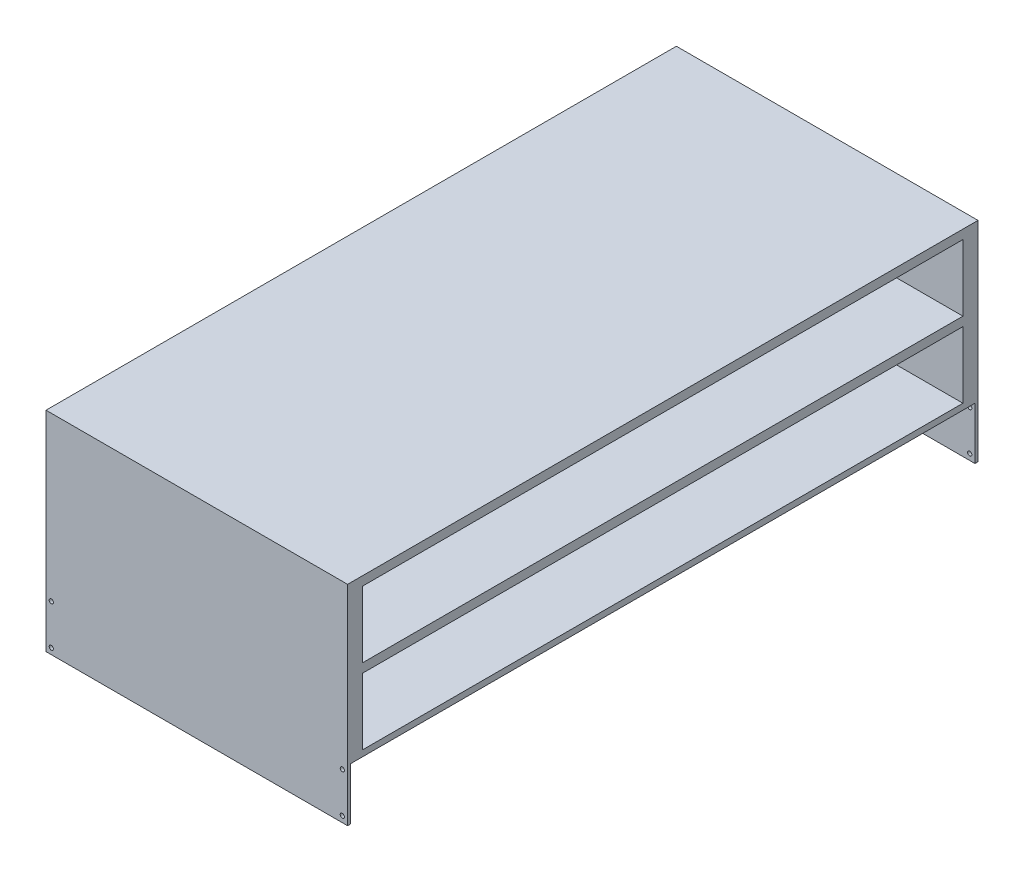
ISO-10303-21;
HEADER;
FILE_DESCRIPTION(('STEP AP214'),'2;1');
FILE_NAME('part.step','',(''),(''),'','','');
FILE_SCHEMA(('AUTOMOTIVE_DESIGN { 1 0 10303 214 1 1 1 1 }'));
ENDSEC;
DATA;
#1=APPLICATION_CONTEXT('core data for automotive mechanical design processes');
#2=APPLICATION_PROTOCOL_DEFINITION('international standard','automotive_design',2000,#1);
#3=PRODUCT_CONTEXT('',#1,'mechanical');
#4=PRODUCT('Part','Part','',(#3));
#5=PRODUCT_RELATED_PRODUCT_CATEGORY('part','',(#4));
#6=PRODUCT_DEFINITION_FORMATION('','',#4);
#7=PRODUCT_DEFINITION_CONTEXT('part definition',#1,'design');
#8=PRODUCT_DEFINITION('design','',#6,#7);
#9=PRODUCT_DEFINITION_SHAPE('','',#8);
#10=(LENGTH_UNIT() NAMED_UNIT(*) SI_UNIT(.MILLI.,.METRE.));
#11=(NAMED_UNIT(*) PLANE_ANGLE_UNIT() SI_UNIT($,.RADIAN.));
#12=(NAMED_UNIT(*) SI_UNIT($,.STERADIAN.) SOLID_ANGLE_UNIT());
#13=UNCERTAINTY_MEASURE_WITH_UNIT(LENGTH_MEASURE(1.E-05),#10,'distance_accuracy_value','');
#14=(GEOMETRIC_REPRESENTATION_CONTEXT(3) GLOBAL_UNCERTAINTY_ASSIGNED_CONTEXT((#13)) GLOBAL_UNIT_ASSIGNED_CONTEXT((#10,
#11,#12)) REPRESENTATION_CONTEXT('',''));
#15=CARTESIAN_POINT('',(0.,0.,0.));
#16=DIRECTION('',(0.,0.,1.));
#17=DIRECTION('',(1.,0.,0.));
#18=AXIS2_PLACEMENT_3D('',#15,#16,#17);
#19=CARTESIAN_POINT('',(500.,606.605,2040.));
#20=DIRECTION('',(0.,0.,1.));
#21=DIRECTION('',(1.,0.,0.));
#22=AXIS2_PLACEMENT_3D('',#19,#20,#21);
#23=PLANE('',#22);
#24=DIRECTION('',(-1.,0.,0.));
#25=VECTOR('',#24,1.);
#26=CARTESIAN_POINT('',(500.,576.605,2040.));
#27=LINE('',#26,#25);
#28=CARTESIAN_POINT('',(500.,576.605,2040.));
#29=VERTEX_POINT('',#28);
#30=CARTESIAN_POINT('',(-500.,576.605,2040.));
#31=VERTEX_POINT('',#30);
#32=EDGE_CURVE('E157',#29,#31,#27,.T.);
#33=ORIENTED_EDGE('',*,*,#32,.F.);
#34=DIRECTION('',(0.,-1.,0.));
#35=VECTOR('',#34,1.);
#36=CARTESIAN_POINT('',(500.,606.605,2040.));
#37=LINE('',#36,#35);
#38=CARTESIAN_POINT('',(500.,356.605,2040.));
#39=VERTEX_POINT('',#38);
#40=EDGE_CURVE('E165',#29,#39,#37,.T.);
#41=ORIENTED_EDGE('',*,*,#40,.T.);
#42=DIRECTION('',(1.,0.,0.));
#43=VECTOR('',#42,1.);
#44=CARTESIAN_POINT('',(-500.,356.605,2040.));
#45=LINE('',#44,#43);
#46=CARTESIAN_POINT('',(-500.,356.605,2040.));
#47=VERTEX_POINT('',#46);
#48=EDGE_CURVE('E322',#47,#39,#45,.T.);
#49=ORIENTED_EDGE('',*,*,#48,.F.);
#50=DIRECTION('',(0.,-1.,0.));
#51=VECTOR('',#50,1.);
#52=CARTESIAN_POINT('',(-500.,606.605,2040.));
#53=LINE('',#52,#51);
#54=EDGE_CURVE('E191',#31,#47,#53,.T.);
#55=ORIENTED_EDGE('',*,*,#54,.F.);
#56=EDGE_LOOP('',(#33,#41,#49,#55));
#57=FACE_BOUND('',#56,.T.);
#58=ADVANCED_FACE('F37',(#57),#23,.F.);
#59=CARTESIAN_POINT('',(-500.,606.605,50.));
#60=DIRECTION('',(0.,0.,-1.));
#61=DIRECTION('',(-1.,0.,0.));
#62=AXIS2_PLACEMENT_3D('',#59,#60,#61);
#63=PLANE('',#62);
#64=DIRECTION('',(-1.,0.,0.));
#65=VECTOR('',#64,1.);
#66=CARTESIAN_POINT('',(500.,576.605,50.));
#67=LINE('',#66,#65);
#68=CARTESIAN_POINT('',(500.,576.605,50.));
#69=VERTEX_POINT('',#68);
#70=CARTESIAN_POINT('',(-500.,576.605,50.));
#71=VERTEX_POINT('',#70);
#72=EDGE_CURVE('E147',#69,#71,#67,.T.);
#73=ORIENTED_EDGE('',*,*,#72,.T.);
#74=DIRECTION('',(0.,-1.,0.));
#75=VECTOR('',#74,1.);
#76=CARTESIAN_POINT('',(-500.,606.605,50.));
#77=LINE('',#76,#75);
#78=CARTESIAN_POINT('',(-500.,356.605,50.));
#79=VERTEX_POINT('',#78);
#80=EDGE_CURVE('E174',#71,#79,#77,.T.);
#81=ORIENTED_EDGE('',*,*,#80,.T.);
#82=DIRECTION('',(1.,0.,0.));
#83=VECTOR('',#82,1.);
#84=CARTESIAN_POINT('',(-500.,356.605,50.));
#85=LINE('',#84,#83);
#86=CARTESIAN_POINT('',(500.,356.605,50.));
#87=VERTEX_POINT('',#86);
#88=EDGE_CURVE('E169',#79,#87,#85,.T.);
#89=ORIENTED_EDGE('',*,*,#88,.T.);
#90=DIRECTION('',(0.,-1.,0.));
#91=VECTOR('',#90,1.);
#92=CARTESIAN_POINT('',(500.,606.605,50.));
#93=LINE('',#92,#91);
#94=EDGE_CURVE('E163',#69,#87,#93,.T.);
#95=ORIENTED_EDGE('',*,*,#94,.F.);
#96=EDGE_LOOP('',(#73,#81,#89,#95));
#97=FACE_BOUND('',#96,.T.);
#98=ADVANCED_FACE('F167',(#97),#63,.F.);
#99=DIRECTION('',(-1.,0.,0.));
#100=VECTOR('',#99,1.);
#101=CARTESIAN_POINT('',(500.,326.605,2040.));
#102=LINE('',#101,#100);
#103=CARTESIAN_POINT('',(500.,326.605,2040.));
#104=VERTEX_POINT('',#103);
#105=CARTESIAN_POINT('',(-500.,326.605,2040.));
#106=VERTEX_POINT('',#105);
#107=EDGE_CURVE('E52',#104,#106,#102,.T.);
#108=ORIENTED_EDGE('',*,*,#107,.F.);
#109=CARTESIAN_POINT('',(500.,106.605,2040.));
#110=VERTEX_POINT('',#109);
#111=EDGE_CURVE('E193',#104,#110,#37,.T.);
#112=ORIENTED_EDGE('',*,*,#111,.T.);
#113=DIRECTION('',(-1.,0.,0.));
#114=VECTOR('',#113,1.);
#115=CARTESIAN_POINT('',(500.,106.605,2040.));
#116=LINE('',#115,#114);
#117=CARTESIAN_POINT('',(-500.,106.605,2040.));
#118=VERTEX_POINT('',#117);
#119=EDGE_CURVE('E181',#110,#118,#116,.T.);
#120=ORIENTED_EDGE('',*,*,#119,.T.);
#121=EDGE_CURVE('E57',#106,#118,#53,.T.);
#122=ORIENTED_EDGE('',*,*,#121,.F.);
#123=EDGE_LOOP('',(#108,#112,#120,#122));
#124=FACE_BOUND('',#123,.T.);
#125=ADVANCED_FACE('F352',(#124),#23,.F.);
#126=DIRECTION('',(-1.,0.,0.));
#127=VECTOR('',#126,1.);
#128=CARTESIAN_POINT('',(500.,326.605,50.));
#129=LINE('',#128,#127);
#130=CARTESIAN_POINT('',(500.,326.605,50.));
#131=VERTEX_POINT('',#130);
#132=CARTESIAN_POINT('',(-500.,326.605,50.));
#133=VERTEX_POINT('',#132);
#134=EDGE_CURVE('E325',#131,#133,#129,.T.);
#135=ORIENTED_EDGE('',*,*,#134,.T.);
#136=CARTESIAN_POINT('',(-500.,106.605,50.));
#137=VERTEX_POINT('',#136);
#138=EDGE_CURVE('E171',#133,#137,#77,.T.);
#139=ORIENTED_EDGE('',*,*,#138,.T.);
#140=DIRECTION('',(1.,0.,0.));
#141=VECTOR('',#140,1.);
#142=CARTESIAN_POINT('',(-500.,106.605,50.));
#143=LINE('',#142,#141);
#144=CARTESIAN_POINT('',(500.,106.605,50.));
#145=VERTEX_POINT('',#144);
#146=EDGE_CURVE('E178',#137,#145,#143,.T.);
#147=ORIENTED_EDGE('',*,*,#146,.T.);
#148=EDGE_CURVE('E172',#131,#145,#93,.T.);
#149=ORIENTED_EDGE('',*,*,#148,.F.);
#150=EDGE_LOOP('',(#135,#139,#147,#149));
#151=FACE_BOUND('',#150,.T.);
#152=ADVANCED_FACE('F358',(#151),#63,.F.);
#153=CARTESIAN_POINT('',(0.,106.605,0.));
#154=DIRECTION('',(0.,-1.,0.));
#155=DIRECTION('',(0.,0.,-1.));
#156=AXIS2_PLACEMENT_3D('',#153,#154,#155);
#157=PLANE('',#156);
#158=ORIENTED_EDGE('',*,*,#146,.F.);
#159=DIRECTION('',(0.,0.,1.));
#160=VECTOR('',#159,1.);
#161=CARTESIAN_POINT('',(-500.,106.605,10.));
#162=LINE('',#161,#160);
#163=EDGE_CURVE('E253',#137,#118,#162,.T.);
#164=ORIENTED_EDGE('',*,*,#163,.T.);
#165=ORIENTED_EDGE('',*,*,#119,.F.);
#166=DIRECTION('',(0.,0.,-1.));
#167=VECTOR('',#166,1.);
#168=CARTESIAN_POINT('',(500.,106.605,10.));
#169=LINE('',#168,#167);
#170=EDGE_CURVE('E250',#110,#145,#169,.T.);
#171=ORIENTED_EDGE('',*,*,#170,.T.);
#172=EDGE_LOOP('',(#158,#164,#165,#171));
#173=FACE_BOUND('',#172,.T.);
#174=ADVANCED_FACE('F365',(#173),#157,.F.);
#175=CARTESIAN_POINT('',(0.,86.6049999999999,2090.));
#176=DIRECTION('',(0.,1.,0.));
#177=DIRECTION('',(0.,0.,1.));
#178=AXIS2_PLACEMENT_3D('',#175,#176,#177);
#179=PLANE('',#178);
#180=DIRECTION('',(-1.,0.,0.));
#181=VECTOR('',#180,1.);
#182=CARTESIAN_POINT('',(-500.,86.6049999999999,2080.));
#183=LINE('',#182,#181);
#184=CARTESIAN_POINT('',(500.,86.6049999999999,2080.));
#185=VERTEX_POINT('',#184);
#186=CARTESIAN_POINT('',(-500.,86.6049999999999,2080.));
#187=VERTEX_POINT('',#186);
#188=EDGE_CURVE('E228',#185,#187,#183,.T.);
#189=ORIENTED_EDGE('',*,*,#188,.T.);
#190=DIRECTION('',(0.,0.,-1.));
#191=VECTOR('',#190,1.);
#192=CARTESIAN_POINT('',(-500.,86.6049999999999,2090.));
#193=LINE('',#192,#191);
#194=CARTESIAN_POINT('',(-500.,86.6049999999999,10.));
#195=VERTEX_POINT('',#194);
#196=EDGE_CURVE('E248',#187,#195,#193,.T.);
#197=ORIENTED_EDGE('',*,*,#196,.T.);
#198=DIRECTION('',(1.,0.,0.));
#199=VECTOR('',#198,1.);
#200=CARTESIAN_POINT('',(0.,86.6049999999999,10.));
#201=LINE('',#200,#199);
#202=CARTESIAN_POINT('',(500.,86.6049999999999,10.));
#203=VERTEX_POINT('',#202);
#204=EDGE_CURVE('E239',#195,#203,#201,.T.);
#205=ORIENTED_EDGE('',*,*,#204,.T.);
#206=DIRECTION('',(0.,0.,-1.));
#207=VECTOR('',#206,1.);
#208=CARTESIAN_POINT('',(500.,86.6049999999999,2090.));
#209=LINE('',#208,#207);
#210=EDGE_CURVE('E244',#185,#203,#209,.T.);
#211=ORIENTED_EDGE('',*,*,#210,.F.);
#212=EDGE_LOOP('',(#189,#197,#205,#211));
#213=FACE_BOUND('',#212,.T.);
#214=ADVANCED_FACE('F371',(#213),#179,.F.);
#215=CARTESIAN_POINT('',(0.,0.,10.));
#216=DIRECTION('',(0.,0.,-1.));
#217=DIRECTION('',(-1.,0.,0.));
#218=AXIS2_PLACEMENT_3D('',#215,#216,#217);
#219=PLANE('',#218);
#220=CARTESIAN_POINT('',(482.5,-66.605,10.));
#221=DIRECTION('',(0.,0.,1.));
#222=DIRECTION('',(1.,0.,0.));
#223=AXIS2_PLACEMENT_3D('',#220,#221,#222);
#224=CIRCLE('',#223,6.99999999999999);
#225=CARTESIAN_POINT('',(489.5,-66.605,10.));
#226=VERTEX_POINT('',#225);
#227=EDGE_CURVE('E257',#226,#226,#224,.T.);
#228=ORIENTED_EDGE('',*,*,#227,.F.);
#229=EDGE_LOOP('',(#228));
#230=FACE_BOUND('',#229,.T.);
#231=CARTESIAN_POINT('',(-482.5,-66.605,10.));
#232=DIRECTION('',(0.,0.,1.));
#233=DIRECTION('',(-1.,0.,0.));
#234=AXIS2_PLACEMENT_3D('',#231,#232,#233);
#235=CIRCLE('',#234,6.99999999999999);
#236=CARTESIAN_POINT('',(-489.5,-66.605,10.));
#237=VERTEX_POINT('',#236);
#238=EDGE_CURVE('E263',#237,#237,#235,.T.);
#239=ORIENTED_EDGE('',*,*,#238,.F.);
#240=EDGE_LOOP('',(#239));
#241=FACE_BOUND('',#240,.T.);
#242=CARTESIAN_POINT('',(482.5,66.6049999999999,10.));
#243=DIRECTION('',(0.,0.,1.));
#244=DIRECTION('',(-1.,0.,0.));
#245=AXIS2_PLACEMENT_3D('',#242,#243,#244);
#246=CIRCLE('',#245,6.99999999999999);
#247=CARTESIAN_POINT('',(475.5,66.6049999999999,10.));
#248=VERTEX_POINT('',#247);
#249=EDGE_CURVE('E269',#248,#248,#246,.T.);
#250=ORIENTED_EDGE('',*,*,#249,.F.);
#251=EDGE_LOOP('',(#250));
#252=FACE_BOUND('',#251,.T.);
#253=CARTESIAN_POINT('',(-482.5,66.6049999999999,10.));
#254=DIRECTION('',(0.,0.,1.));
#255=DIRECTION('',(1.,0.,0.));
#256=AXIS2_PLACEMENT_3D('',#253,#254,#255);
#257=CIRCLE('',#256,6.99999999999999);
#258=CARTESIAN_POINT('',(-475.5,66.6049999999999,10.));
#259=VERTEX_POINT('',#258);
#260=EDGE_CURVE('E275',#259,#259,#257,.T.);
#261=ORIENTED_EDGE('',*,*,#260,.F.);
#262=EDGE_LOOP('',(#261));
#263=FACE_BOUND('',#262,.T.);
#264=ORIENTED_EDGE('',*,*,#204,.F.);
#265=DIRECTION('',(0.,-1.,0.));
#266=VECTOR('',#265,1.);
#267=CARTESIAN_POINT('',(-500.,-86.6050000000001,10.));
#268=LINE('',#267,#266);
#269=CARTESIAN_POINT('',(-500.,-86.6050000000001,10.));
#270=VERTEX_POINT('',#269);
#271=EDGE_CURVE('E284',#195,#270,#268,.T.);
#272=ORIENTED_EDGE('',*,*,#271,.T.);
#273=DIRECTION('',(1.,0.,0.));
#274=VECTOR('',#273,1.);
#275=CARTESIAN_POINT('',(-500.,-86.6050000000001,10.));
#276=LINE('',#275,#274);
#277=CARTESIAN_POINT('',(500.,-86.6050000000001,10.));
#278=VERTEX_POINT('',#277);
#279=EDGE_CURVE('E287',#270,#278,#276,.T.);
#280=ORIENTED_EDGE('',*,*,#279,.T.);
#281=DIRECTION('',(0.,1.,0.));
#282=VECTOR('',#281,1.);
#283=CARTESIAN_POINT('',(500.,-86.6050000000001,10.));
#284=LINE('',#283,#282);
#285=EDGE_CURVE('E281',#278,#203,#284,.T.);
#286=ORIENTED_EDGE('',*,*,#285,.T.);
#287=EDGE_LOOP('',(#264,#272,#280,#286));
#288=FACE_BOUND('',#287,.T.);
#289=ADVANCED_FACE('F402',(#230,#241,#252,#263,#288),#219,.F.);
#290=CARTESIAN_POINT('',(0.,0.,0.));
#291=DIRECTION('',(0.,0.,-1.));
#292=DIRECTION('',(-1.,0.,0.));
#293=AXIS2_PLACEMENT_3D('',#290,#291,#292);
#294=PLANE('',#293);
#295=CARTESIAN_POINT('',(-482.5,-66.605,0.));
#296=DIRECTION('',(0.,0.,1.));
#297=DIRECTION('',(-1.,0.,0.));
#298=AXIS2_PLACEMENT_3D('',#295,#296,#297);
#299=CIRCLE('',#298,6.99999999999999);
#300=CARTESIAN_POINT('',(-489.5,-66.605,0.));
#301=VERTEX_POINT('',#300);
#302=EDGE_CURVE('E260',#301,#301,#299,.T.);
#303=ORIENTED_EDGE('',*,*,#302,.T.);
#304=EDGE_LOOP('',(#303));
#305=FACE_BOUND('',#304,.T.);
#306=CARTESIAN_POINT('',(-482.5,66.6049999999999,0.));
#307=DIRECTION('',(0.,0.,1.));
#308=DIRECTION('',(1.,0.,0.));
#309=AXIS2_PLACEMENT_3D('',#306,#307,#308);
#310=CIRCLE('',#309,6.99999999999999);
#311=CARTESIAN_POINT('',(-475.5,66.6049999999999,0.));
#312=VERTEX_POINT('',#311);
#313=EDGE_CURVE('E272',#312,#312,#310,.T.);
#314=ORIENTED_EDGE('',*,*,#313,.T.);
#315=EDGE_LOOP('',(#314));
#316=FACE_BOUND('',#315,.T.);
#317=DIRECTION('',(0.,1.,0.));
#318=VECTOR('',#317,1.);
#319=CARTESIAN_POINT('',(500.,-86.6050000000001,0.));
#320=LINE('',#319,#318);
#321=CARTESIAN_POINT('',(500.,-86.6050000000001,0.));
#322=VERTEX_POINT('',#321);
#323=CARTESIAN_POINT('',(500.,606.605,0.));
#324=VERTEX_POINT('',#323);
#325=EDGE_CURVE('E278',#322,#324,#320,.T.);
#326=ORIENTED_EDGE('',*,*,#325,.F.);
#327=DIRECTION('',(1.,0.,0.));
#328=VECTOR('',#327,1.);
#329=CARTESIAN_POINT('',(-500.,-86.6050000000001,0.));
#330=LINE('',#329,#328);
#331=CARTESIAN_POINT('',(-500.,-86.6050000000001,0.));
#332=VERTEX_POINT('',#331);
#333=EDGE_CURVE('E285',#332,#322,#330,.T.);
#334=ORIENTED_EDGE('',*,*,#333,.F.);
#335=DIRECTION('',(0.,-1.,0.));
#336=VECTOR('',#335,1.);
#337=CARTESIAN_POINT('',(-500.,-86.6050000000001,0.));
#338=LINE('',#337,#336);
#339=CARTESIAN_POINT('',(-500.,606.605,0.));
#340=VERTEX_POINT('',#339);
#341=EDGE_CURVE('E291',#340,#332,#338,.T.);
#342=ORIENTED_EDGE('',*,*,#341,.F.);
#343=DIRECTION('',(-1.,0.,0.));
#344=VECTOR('',#343,1.);
#345=CARTESIAN_POINT('',(500.,606.605,0.));
#346=LINE('',#345,#344);
#347=EDGE_CURVE('E176',#324,#340,#346,.T.);
#348=ORIENTED_EDGE('',*,*,#347,.F.);
#349=EDGE_LOOP('',(#326,#334,#342,#348));
#350=FACE_BOUND('',#349,.T.);
#351=CARTESIAN_POINT('',(482.5,66.6049999999999,0.));
#352=DIRECTION('',(0.,0.,1.));
#353=DIRECTION('',(-1.,0.,0.));
#354=AXIS2_PLACEMENT_3D('',#351,#352,#353);
#355=CIRCLE('',#354,6.99999999999999);
#356=CARTESIAN_POINT('',(475.5,66.6049999999999,0.));
#357=VERTEX_POINT('',#356);
#358=EDGE_CURVE('E266',#357,#357,#355,.T.);
#359=ORIENTED_EDGE('',*,*,#358,.T.);
#360=EDGE_LOOP('',(#359));
#361=FACE_BOUND('',#360,.T.);
#362=CARTESIAN_POINT('',(482.5,-66.605,0.));
#363=DIRECTION('',(0.,0.,1.));
#364=DIRECTION('',(1.,0.,0.));
#365=AXIS2_PLACEMENT_3D('',#362,#363,#364);
#366=CIRCLE('',#365,6.99999999999999);
#367=CARTESIAN_POINT('',(489.5,-66.605,0.));
#368=VERTEX_POINT('',#367);
#369=EDGE_CURVE('E256',#368,#368,#366,.T.);
#370=ORIENTED_EDGE('',*,*,#369,.T.);
#371=EDGE_LOOP('',(#370));
#372=FACE_BOUND('',#371,.T.);
#373=ADVANCED_FACE('F304',(#305,#316,#350,#361,#372),#294,.T.);
#374=CARTESIAN_POINT('',(500.,-86.6050000000001,10.));
#375=DIRECTION('',(-1.,0.,0.));
#376=DIRECTION('',(0.,0.,1.));
#377=AXIS2_PLACEMENT_3D('',#374,#375,#376);
#378=PLANE('',#377);
#379=DIRECTION('',(0.,0.,1.));
#380=VECTOR('',#379,1.);
#381=CARTESIAN_POINT('',(500.,576.605,50.));
#382=LINE('',#381,#380);
#383=EDGE_CURVE('E150',#69,#29,#382,.T.);
#384=ORIENTED_EDGE('',*,*,#383,.F.);
#385=ORIENTED_EDGE('',*,*,#94,.T.);
#386=DIRECTION('',(0.,0.,1.));
#387=VECTOR('',#386,1.);
#388=CARTESIAN_POINT('',(500.,356.605,50.));
#389=LINE('',#388,#387);
#390=EDGE_CURVE('E320',#87,#39,#389,.T.);
#391=ORIENTED_EDGE('',*,*,#390,.T.);
#392=ORIENTED_EDGE('',*,*,#40,.F.);
#393=EDGE_LOOP('',(#384,#385,#391,#392));
#394=FACE_BOUND('',#393,.T.);
#395=ORIENTED_EDGE('',*,*,#111,.F.);
#396=DIRECTION('',(0.,0.,1.));
#397=VECTOR('',#396,1.);
#398=CARTESIAN_POINT('',(500.,326.605,50.));
#399=LINE('',#398,#397);
#400=EDGE_CURVE('E310',#131,#104,#399,.T.);
#401=ORIENTED_EDGE('',*,*,#400,.F.);
#402=ORIENTED_EDGE('',*,*,#148,.T.);
#403=ORIENTED_EDGE('',*,*,#170,.F.);
#404=EDGE_LOOP('',(#395,#401,#402,#403));
#405=FACE_BOUND('',#404,.T.);
#406=ORIENTED_EDGE('',*,*,#325,.T.);
#407=DIRECTION('',(0.,0.,-1.));
#408=VECTOR('',#407,1.);
#409=CARTESIAN_POINT('',(500.,606.605,2090.));
#410=LINE('',#409,#408);
#411=CARTESIAN_POINT('',(500.,606.605,2090.));
#412=VERTEX_POINT('',#411);
#413=EDGE_CURVE('E188',#412,#324,#410,.T.);
#414=ORIENTED_EDGE('',*,*,#413,.F.);
#415=DIRECTION('',(0.,1.,0.));
#416=VECTOR('',#415,1.);
#417=CARTESIAN_POINT('',(500.,0.,2090.));
#418=LINE('',#417,#416);
#419=CARTESIAN_POINT('',(500.,-86.6050000000001,2090.));
#420=VERTEX_POINT('',#419);
#421=EDGE_CURVE('E242',#420,#412,#418,.T.);
#422=ORIENTED_EDGE('',*,*,#421,.F.);
#423=DIRECTION('',(0.,0.,1.));
#424=VECTOR('',#423,1.);
#425=CARTESIAN_POINT('',(500.,-86.6050000000001,2080.));
#426=LINE('',#425,#424);
#427=CARTESIAN_POINT('',(500.,-86.6050000000001,2080.));
#428=VERTEX_POINT('',#427);
#429=EDGE_CURVE('E236',#428,#420,#426,.T.);
#430=ORIENTED_EDGE('',*,*,#429,.F.);
#431=DIRECTION('',(0.,1.,0.));
#432=VECTOR('',#431,1.);
#433=CARTESIAN_POINT('',(500.,-86.6050000000001,2080.));
#434=LINE('',#433,#432);
#435=EDGE_CURVE('E220',#428,#185,#434,.T.);
#436=ORIENTED_EDGE('',*,*,#435,.T.);
#437=ORIENTED_EDGE('',*,*,#210,.T.);
#438=ORIENTED_EDGE('',*,*,#285,.F.);
#439=DIRECTION('',(0.,0.,-1.));
#440=VECTOR('',#439,1.);
#441=CARTESIAN_POINT('',(500.,-86.6050000000001,10.));
#442=LINE('',#441,#440);
#443=EDGE_CURVE('E45',#278,#322,#442,.T.);
#444=ORIENTED_EDGE('',*,*,#443,.T.);
#445=EDGE_LOOP('',(#406,#414,#422,#430,#436,#437,#438,#444));
#446=FACE_BOUND('',#445,.T.);
#447=ADVANCED_FACE('F39',(#394,#405,#446),#378,.F.);
#448=CARTESIAN_POINT('',(-500.,-86.6050000000001,10.));
#449=DIRECTION('',(1.,0.,0.));
#450=DIRECTION('',(0.,0.,-1.));
#451=AXIS2_PLACEMENT_3D('',#448,#449,#450);
#452=PLANE('',#451);
#453=ORIENTED_EDGE('',*,*,#80,.F.);
#454=DIRECTION('',(0.,0.,1.));
#455=VECTOR('',#454,1.);
#456=CARTESIAN_POINT('',(-500.,576.605,50.));
#457=LINE('',#456,#455);
#458=EDGE_CURVE('E153',#71,#31,#457,.T.);
#459=ORIENTED_EDGE('',*,*,#458,.T.);
#460=ORIENTED_EDGE('',*,*,#54,.T.);
#461=DIRECTION('',(0.,0.,1.));
#462=VECTOR('',#461,1.);
#463=CARTESIAN_POINT('',(-500.,356.605,50.));
#464=LINE('',#463,#462);
#465=EDGE_CURVE('E317',#79,#47,#464,.T.);
#466=ORIENTED_EDGE('',*,*,#465,.F.);
#467=EDGE_LOOP('',(#453,#459,#460,#466));
#468=FACE_BOUND('',#467,.T.);
#469=DIRECTION('',(0.,0.,1.));
#470=VECTOR('',#469,1.);
#471=CARTESIAN_POINT('',(-500.,606.605,2040.));
#472=LINE('',#471,#470);
#473=CARTESIAN_POINT('',(-500.,606.605,2090.));
#474=VERTEX_POINT('',#473);
#475=EDGE_CURVE('E182',#340,#474,#472,.T.);
#476=ORIENTED_EDGE('',*,*,#475,.F.);
#477=ORIENTED_EDGE('',*,*,#341,.T.);
#478=DIRECTION('',(0.,0.,-1.));
#479=VECTOR('',#478,1.);
#480=CARTESIAN_POINT('',(-500.,-86.6050000000001,10.));
#481=LINE('',#480,#479);
#482=EDGE_CURVE('E11',#270,#332,#481,.T.);
#483=ORIENTED_EDGE('',*,*,#482,.F.);
#484=ORIENTED_EDGE('',*,*,#271,.F.);
#485=ORIENTED_EDGE('',*,*,#196,.F.);
#486=DIRECTION('',(0.,-1.,0.));
#487=VECTOR('',#486,1.);
#488=CARTESIAN_POINT('',(-500.,-86.6050000000001,2080.));
#489=LINE('',#488,#487);
#490=CARTESIAN_POINT('',(-500.,-86.6050000000001,2080.));
#491=VERTEX_POINT('',#490);
#492=EDGE_CURVE('E225',#187,#491,#489,.T.);
#493=ORIENTED_EDGE('',*,*,#492,.T.);
#494=DIRECTION('',(0.,0.,1.));
#495=VECTOR('',#494,1.);
#496=CARTESIAN_POINT('',(-500.,-86.6050000000001,2080.));
#497=LINE('',#496,#495);
#498=CARTESIAN_POINT('',(-500.,-86.6050000000001,2090.));
#499=VERTEX_POINT('',#498);
#500=EDGE_CURVE('E231',#491,#499,#497,.T.);
#501=ORIENTED_EDGE('',*,*,#500,.T.);
#502=DIRECTION('',(0.,1.,0.));
#503=VECTOR('',#502,1.);
#504=CARTESIAN_POINT('',(-500.,0.,2090.));
#505=LINE('',#504,#503);
#506=EDGE_CURVE('E240',#499,#474,#505,.T.);
#507=ORIENTED_EDGE('',*,*,#506,.T.);
#508=EDGE_LOOP('',(#476,#477,#483,#484,#485,#493,#501,#507));
#509=FACE_BOUND('',#508,.T.);
#510=DIRECTION('',(0.,0.,1.));
#511=VECTOR('',#510,1.);
#512=CARTESIAN_POINT('',(-500.,326.605,50.));
#513=LINE('',#512,#511);
#514=EDGE_CURVE('E314',#133,#106,#513,.T.);
#515=ORIENTED_EDGE('',*,*,#514,.T.);
#516=ORIENTED_EDGE('',*,*,#121,.T.);
#517=ORIENTED_EDGE('',*,*,#163,.F.);
#518=ORIENTED_EDGE('',*,*,#138,.F.);
#519=EDGE_LOOP('',(#515,#516,#517,#518));
#520=FACE_BOUND('',#519,.T.);
#521=ADVANCED_FACE('F333',(#468,#509,#520),#452,.F.);
#522=CARTESIAN_POINT('',(-500.,-86.6050000000001,10.));
#523=DIRECTION('',(0.,1.,0.));
#524=DIRECTION('',(0.,0.,1.));
#525=AXIS2_PLACEMENT_3D('',#522,#523,#524);
#526=PLANE('',#525);
#527=ORIENTED_EDGE('',*,*,#333,.T.);
#528=ORIENTED_EDGE('',*,*,#443,.F.);
#529=ORIENTED_EDGE('',*,*,#279,.F.);
#530=ORIENTED_EDGE('',*,*,#482,.T.);
#531=EDGE_LOOP('',(#527,#528,#529,#530));
#532=FACE_BOUND('',#531,.T.);
#533=ADVANCED_FACE('F403',(#532),#526,.F.);
#534=CARTESIAN_POINT('',(-482.5,66.6049999999999,10.));
#535=DIRECTION('',(0.,0.,-1.));
#536=DIRECTION('',(-1.,0.,0.));
#537=AXIS2_PLACEMENT_3D('',#534,#535,#536);
#538=CYLINDRICAL_SURFACE('',#537,6.99999999999999);
#539=ORIENTED_EDGE('',*,*,#260,.T.);
#540=EDGE_LOOP('',(#539));
#541=FACE_BOUND('',#540,.T.);
#542=ORIENTED_EDGE('',*,*,#313,.F.);
#543=EDGE_LOOP('',(#542));
#544=FACE_BOUND('',#543,.T.);
#545=ADVANCED_FACE('F405',(#541,#544),#538,.F.);
#546=CARTESIAN_POINT('',(482.5,66.6049999999999,10.));
#547=DIRECTION('',(0.,0.,-1.));
#548=DIRECTION('',(-1.,0.,0.));
#549=AXIS2_PLACEMENT_3D('',#546,#547,#548);
#550=CYLINDRICAL_SURFACE('',#549,6.99999999999999);
#551=ORIENTED_EDGE('',*,*,#249,.T.);
#552=EDGE_LOOP('',(#551));
#553=FACE_BOUND('',#552,.T.);
#554=ORIENTED_EDGE('',*,*,#358,.F.);
#555=EDGE_LOOP('',(#554));
#556=FACE_BOUND('',#555,.T.);
#557=ADVANCED_FACE('F411',(#553,#556),#550,.F.);
#558=CARTESIAN_POINT('',(-482.5,-66.605,10.));
#559=DIRECTION('',(0.,0.,-1.));
#560=DIRECTION('',(-1.,0.,0.));
#561=AXIS2_PLACEMENT_3D('',#558,#559,#560);
#562=CYLINDRICAL_SURFACE('',#561,6.99999999999999);
#563=ORIENTED_EDGE('',*,*,#238,.T.);
#564=EDGE_LOOP('',(#563));
#565=FACE_BOUND('',#564,.T.);
#566=ORIENTED_EDGE('',*,*,#302,.F.);
#567=EDGE_LOOP('',(#566));
#568=FACE_BOUND('',#567,.T.);
#569=ADVANCED_FACE('F422',(#565,#568),#562,.F.);
#570=CARTESIAN_POINT('',(482.5,-66.605,10.));
#571=DIRECTION('',(0.,0.,-1.));
#572=DIRECTION('',(-1.,0.,0.));
#573=AXIS2_PLACEMENT_3D('',#570,#571,#572);
#574=CYLINDRICAL_SURFACE('',#573,6.99999999999999);
#575=ORIENTED_EDGE('',*,*,#227,.T.);
#576=EDGE_LOOP('',(#575));
#577=FACE_BOUND('',#576,.T.);
#578=ORIENTED_EDGE('',*,*,#369,.F.);
#579=EDGE_LOOP('',(#578));
#580=FACE_BOUND('',#579,.T.);
#581=ADVANCED_FACE('F426',(#577,#580),#574,.F.);
#582=CARTESIAN_POINT('',(0.,0.,2090.));
#583=DIRECTION('',(0.,0.,1.));
#584=DIRECTION('',(1.,0.,0.));
#585=AXIS2_PLACEMENT_3D('',#582,#583,#584);
#586=PLANE('',#585);
#587=ORIENTED_EDGE('',*,*,#506,.F.);
#588=DIRECTION('',(1.,0.,0.));
#589=VECTOR('',#588,1.);
#590=CARTESIAN_POINT('',(-500.,-86.6050000000001,2090.));
#591=LINE('',#590,#589);
#592=EDGE_CURVE('E217',#499,#420,#591,.T.);
#593=ORIENTED_EDGE('',*,*,#592,.T.);
#594=ORIENTED_EDGE('',*,*,#421,.T.);
#595=DIRECTION('',(1.,0.,0.));
#596=VECTOR('',#595,1.);
#597=CARTESIAN_POINT('',(-500.,606.605,2090.));
#598=LINE('',#597,#596);
#599=EDGE_CURVE('E185',#474,#412,#598,.T.);
#600=ORIENTED_EDGE('',*,*,#599,.F.);
#601=EDGE_LOOP('',(#587,#593,#594,#600));
#602=FACE_BOUND('',#601,.T.);
#603=CARTESIAN_POINT('',(482.5,-66.605,2090.));
#604=DIRECTION('',(0.,0.,1.));
#605=DIRECTION('',(1.,0.,0.));
#606=AXIS2_PLACEMENT_3D('',#603,#604,#605);
#607=CIRCLE('',#606,6.99999999999999);
#608=CARTESIAN_POINT('',(489.5,-66.605,2090.));
#609=VERTEX_POINT('',#608);
#610=EDGE_CURVE('E195',#609,#609,#607,.T.);
#611=ORIENTED_EDGE('',*,*,#610,.F.);
#612=EDGE_LOOP('',(#611));
#613=FACE_BOUND('',#612,.T.);
#614=CARTESIAN_POINT('',(-482.5,-66.605,2090.));
#615=DIRECTION('',(0.,0.,1.));
#616=DIRECTION('',(-1.,0.,0.));
#617=AXIS2_PLACEMENT_3D('',#614,#615,#616);
#618=CIRCLE('',#617,6.99999999999999);
#619=CARTESIAN_POINT('',(-489.5,-66.605,2090.));
#620=VERTEX_POINT('',#619);
#621=EDGE_CURVE('E199',#620,#620,#618,.T.);
#622=ORIENTED_EDGE('',*,*,#621,.F.);
#623=EDGE_LOOP('',(#622));
#624=FACE_BOUND('',#623,.T.);
#625=CARTESIAN_POINT('',(482.5,66.6049999999999,2090.));
#626=DIRECTION('',(0.,0.,1.));
#627=DIRECTION('',(-1.,0.,0.));
#628=AXIS2_PLACEMENT_3D('',#625,#626,#627);
#629=CIRCLE('',#628,6.99999999999999);
#630=CARTESIAN_POINT('',(475.5,66.6049999999999,2090.));
#631=VERTEX_POINT('',#630);
#632=EDGE_CURVE('E205',#631,#631,#629,.T.);
#633=ORIENTED_EDGE('',*,*,#632,.F.);
#634=EDGE_LOOP('',(#633));
#635=FACE_BOUND('',#634,.T.);
#636=CARTESIAN_POINT('',(-482.5,66.6049999999999,2090.));
#637=DIRECTION('',(0.,0.,1.));
#638=DIRECTION('',(1.,0.,0.));
#639=AXIS2_PLACEMENT_3D('',#636,#637,#638);
#640=CIRCLE('',#639,6.99999999999999);
#641=CARTESIAN_POINT('',(-475.5,66.6049999999999,2090.));
#642=VERTEX_POINT('',#641);
#643=EDGE_CURVE('E211',#642,#642,#640,.T.);
#644=ORIENTED_EDGE('',*,*,#643,.F.);
#645=EDGE_LOOP('',(#644));
#646=FACE_BOUND('',#645,.T.);
#647=ADVANCED_FACE('F387',(#602,#613,#624,#635,#646),#586,.T.);
#648=CARTESIAN_POINT('',(-500.,-86.6050000000001,2080.));
#649=DIRECTION('',(0.,-1.,0.));
#650=DIRECTION('',(0.,0.,-1.));
#651=AXIS2_PLACEMENT_3D('',#648,#649,#650);
#652=PLANE('',#651);
#653=ORIENTED_EDGE('',*,*,#592,.F.);
#654=ORIENTED_EDGE('',*,*,#500,.F.);
#655=DIRECTION('',(1.,0.,0.));
#656=VECTOR('',#655,1.);
#657=CARTESIAN_POINT('',(-500.,-86.6050000000001,2080.));
#658=LINE('',#657,#656);
#659=EDGE_CURVE('E222',#491,#428,#658,.T.);
#660=ORIENTED_EDGE('',*,*,#659,.T.);
#661=ORIENTED_EDGE('',*,*,#429,.T.);
#662=EDGE_LOOP('',(#653,#654,#660,#661));
#663=FACE_BOUND('',#662,.T.);
#664=ADVANCED_FACE('F391',(#663),#652,.T.);
#665=CARTESIAN_POINT('',(0.,0.,2080.));
#666=DIRECTION('',(0.,0.,1.));
#667=DIRECTION('',(-1.,0.,0.));
#668=AXIS2_PLACEMENT_3D('',#665,#666,#667);
#669=PLANE('',#668);
#670=CARTESIAN_POINT('',(482.5,-66.605,2080.));
#671=DIRECTION('',(0.,0.,1.));
#672=DIRECTION('',(1.,0.,0.));
#673=AXIS2_PLACEMENT_3D('',#670,#671,#672);
#674=CIRCLE('',#673,6.99999999999999);
#675=CARTESIAN_POINT('',(489.5,-66.605,2080.));
#676=VERTEX_POINT('',#675);
#677=EDGE_CURVE('E196',#676,#676,#674,.T.);
#678=ORIENTED_EDGE('',*,*,#677,.T.);
#679=EDGE_LOOP('',(#678));
#680=FACE_BOUND('',#679,.T.);
#681=CARTESIAN_POINT('',(-482.5,-66.605,2080.));
#682=DIRECTION('',(0.,0.,1.));
#683=DIRECTION('',(-1.,0.,0.));
#684=AXIS2_PLACEMENT_3D('',#681,#682,#683);
#685=CIRCLE('',#684,6.99999999999999);
#686=CARTESIAN_POINT('',(-489.5,-66.605,2080.));
#687=VERTEX_POINT('',#686);
#688=EDGE_CURVE('E202',#687,#687,#685,.T.);
#689=ORIENTED_EDGE('',*,*,#688,.T.);
#690=EDGE_LOOP('',(#689));
#691=FACE_BOUND('',#690,.T.);
#692=CARTESIAN_POINT('',(482.5,66.6049999999999,2080.));
#693=DIRECTION('',(0.,0.,1.));
#694=DIRECTION('',(-1.,0.,0.));
#695=AXIS2_PLACEMENT_3D('',#692,#693,#694);
#696=CIRCLE('',#695,6.99999999999999);
#697=CARTESIAN_POINT('',(475.5,66.6049999999999,2080.));
#698=VERTEX_POINT('',#697);
#699=EDGE_CURVE('E208',#698,#698,#696,.T.);
#700=ORIENTED_EDGE('',*,*,#699,.T.);
#701=EDGE_LOOP('',(#700));
#702=FACE_BOUND('',#701,.T.);
#703=CARTESIAN_POINT('',(-482.5,66.6049999999999,2080.));
#704=DIRECTION('',(0.,0.,1.));
#705=DIRECTION('',(1.,0.,0.));
#706=AXIS2_PLACEMENT_3D('',#703,#704,#705);
#707=CIRCLE('',#706,6.99999999999999);
#708=CARTESIAN_POINT('',(-475.5,66.6049999999999,2080.));
#709=VERTEX_POINT('',#708);
#710=EDGE_CURVE('E214',#709,#709,#707,.T.);
#711=ORIENTED_EDGE('',*,*,#710,.T.);
#712=EDGE_LOOP('',(#711));
#713=FACE_BOUND('',#712,.T.);
#714=ORIENTED_EDGE('',*,*,#435,.F.);
#715=ORIENTED_EDGE('',*,*,#659,.F.);
#716=ORIENTED_EDGE('',*,*,#492,.F.);
#717=ORIENTED_EDGE('',*,*,#188,.F.);
#718=EDGE_LOOP('',(#714,#715,#716,#717));
#719=FACE_BOUND('',#718,.T.);
#720=ADVANCED_FACE('F394',(#680,#691,#702,#713,#719),#669,.F.);
#721=CARTESIAN_POINT('',(-482.5,66.6049999999999,2080.));
#722=DIRECTION('',(0.,0.,1.));
#723=DIRECTION('',(1.,0.,0.));
#724=AXIS2_PLACEMENT_3D('',#721,#722,#723);
#725=CYLINDRICAL_SURFACE('',#724,6.99999999999999);
#726=ORIENTED_EDGE('',*,*,#710,.F.);
#727=EDGE_LOOP('',(#726));
#728=FACE_BOUND('',#727,.T.);
#729=ORIENTED_EDGE('',*,*,#643,.T.);
#730=EDGE_LOOP('',(#729));
#731=FACE_BOUND('',#730,.T.);
#732=ADVANCED_FACE('F438',(#728,#731),#725,.F.);
#733=CARTESIAN_POINT('',(482.5,66.6049999999999,2080.));
#734=DIRECTION('',(0.,0.,1.));
#735=DIRECTION('',(1.,0.,0.));
#736=AXIS2_PLACEMENT_3D('',#733,#734,#735);
#737=CYLINDRICAL_SURFACE('',#736,6.99999999999999);
#738=ORIENTED_EDGE('',*,*,#699,.F.);
#739=EDGE_LOOP('',(#738));
#740=FACE_BOUND('',#739,.T.);
#741=ORIENTED_EDGE('',*,*,#632,.T.);
#742=EDGE_LOOP('',(#741));
#743=FACE_BOUND('',#742,.T.);
#744=ADVANCED_FACE('F442',(#740,#743),#737,.F.);
#745=CARTESIAN_POINT('',(-482.5,-66.605,2080.));
#746=DIRECTION('',(0.,0.,1.));
#747=DIRECTION('',(1.,0.,0.));
#748=AXIS2_PLACEMENT_3D('',#745,#746,#747);
#749=CYLINDRICAL_SURFACE('',#748,6.99999999999999);
#750=ORIENTED_EDGE('',*,*,#688,.F.);
#751=EDGE_LOOP('',(#750));
#752=FACE_BOUND('',#751,.T.);
#753=ORIENTED_EDGE('',*,*,#621,.T.);
#754=EDGE_LOOP('',(#753));
#755=FACE_BOUND('',#754,.T.);
#756=ADVANCED_FACE('F380',(#752,#755),#749,.F.);
#757=CARTESIAN_POINT('',(482.5,-66.605,2080.));
#758=DIRECTION('',(0.,0.,1.));
#759=DIRECTION('',(1.,0.,0.));
#760=AXIS2_PLACEMENT_3D('',#757,#758,#759);
#761=CYLINDRICAL_SURFACE('',#760,6.99999999999999);
#762=ORIENTED_EDGE('',*,*,#677,.F.);
#763=EDGE_LOOP('',(#762));
#764=FACE_BOUND('',#763,.T.);
#765=ORIENTED_EDGE('',*,*,#610,.T.);
#766=EDGE_LOOP('',(#765));
#767=FACE_BOUND('',#766,.T.);
#768=ADVANCED_FACE('F375',(#764,#767),#761,.F.);
#769=CARTESIAN_POINT('',(0.,606.605,0.));
#770=DIRECTION('',(0.,1.,0.));
#771=DIRECTION('',(0.,0.,1.));
#772=AXIS2_PLACEMENT_3D('',#769,#770,#771);
#773=PLANE('',#772);
#774=ORIENTED_EDGE('',*,*,#475,.T.);
#775=ORIENTED_EDGE('',*,*,#599,.T.);
#776=ORIENTED_EDGE('',*,*,#413,.T.);
#777=ORIENTED_EDGE('',*,*,#347,.T.);
#778=EDGE_LOOP('',(#774,#775,#776,#777));
#779=FACE_BOUND('',#778,.T.);
#780=ADVANCED_FACE('F347',(#779),#773,.T.);
#781=CARTESIAN_POINT('',(500.,326.605,50.));
#782=DIRECTION('',(0.,1.,0.));
#783=DIRECTION('',(0.,0.,1.));
#784=AXIS2_PLACEMENT_3D('',#781,#782,#783);
#785=PLANE('',#784);
#786=ORIENTED_EDGE('',*,*,#107,.T.);
#787=ORIENTED_EDGE('',*,*,#514,.F.);
#788=ORIENTED_EDGE('',*,*,#134,.F.);
#789=ORIENTED_EDGE('',*,*,#400,.T.);
#790=EDGE_LOOP('',(#786,#787,#788,#789));
#791=FACE_BOUND('',#790,.T.);
#792=ADVANCED_FACE('F340',(#791),#785,.F.);
#793=CARTESIAN_POINT('',(-500.,356.605,50.));
#794=DIRECTION('',(0.,-1.,0.));
#795=DIRECTION('',(1.,0.,0.));
#796=AXIS2_PLACEMENT_3D('',#793,#794,#795);
#797=PLANE('',#796);
#798=ORIENTED_EDGE('',*,*,#48,.T.);
#799=ORIENTED_EDGE('',*,*,#390,.F.);
#800=ORIENTED_EDGE('',*,*,#88,.F.);
#801=ORIENTED_EDGE('',*,*,#465,.T.);
#802=EDGE_LOOP('',(#798,#799,#800,#801));
#803=FACE_BOUND('',#802,.T.);
#804=ADVANCED_FACE('F338',(#803),#797,.F.);
#805=CARTESIAN_POINT('',(500.,576.605,50.));
#806=DIRECTION('',(0.,1.,0.));
#807=DIRECTION('',(0.,0.,1.));
#808=AXIS2_PLACEMENT_3D('',#805,#806,#807);
#809=PLANE('',#808);
#810=ORIENTED_EDGE('',*,*,#32,.T.);
#811=ORIENTED_EDGE('',*,*,#458,.F.);
#812=ORIENTED_EDGE('',*,*,#72,.F.);
#813=ORIENTED_EDGE('',*,*,#383,.T.);
#814=EDGE_LOOP('',(#810,#811,#812,#813));
#815=FACE_BOUND('',#814,.T.);
#816=ADVANCED_FACE('F149',(#815),#809,.F.);
#817=CLOSED_SHELL('',(#58,#98,#125,#152,#174,#214,#289,#373,#447,#521,#533,#545,#557,#569,#581,
#647,#664,#720,#732,#744,#756,#768,#780,#792,#804,#816));
#818=MANIFOLD_SOLID_BREP('B2',#817);
#819=ADVANCED_BREP_SHAPE_REPRESENTATION('',(#18,#818),#14);
#820=SHAPE_DEFINITION_REPRESENTATION(#9,#819);
ENDSEC;
END-ISO-10303-21;
